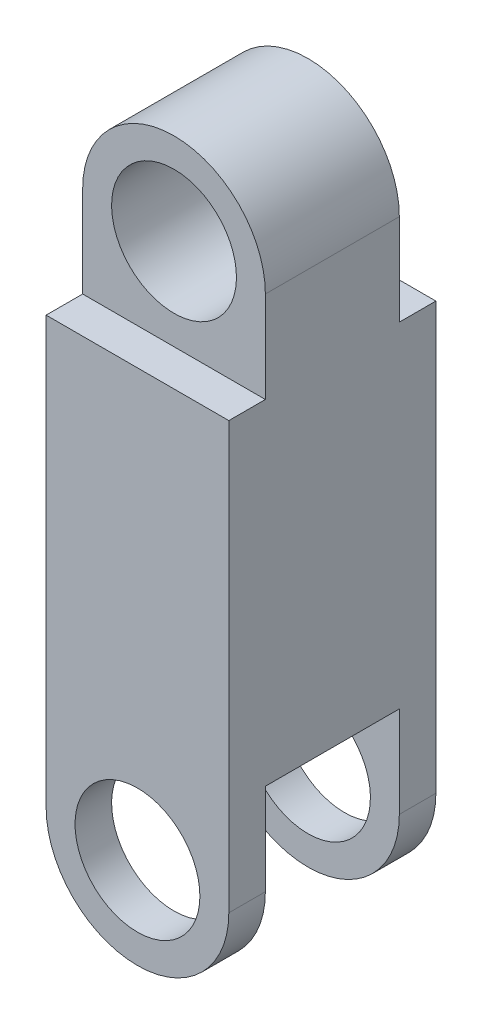
ISO-10303-21;
HEADER;
FILE_DESCRIPTION(('STEP AP214'),'2;1');
FILE_NAME('part.step','',(''),(''),'','','');
FILE_SCHEMA(('AUTOMOTIVE_DESIGN { 1 0 10303 214 1 1 1 1 }'));
ENDSEC;
DATA;
#1=APPLICATION_CONTEXT('core data for automotive mechanical design processes');
#2=APPLICATION_PROTOCOL_DEFINITION('international standard','automotive_design',2000,#1);
#3=PRODUCT_CONTEXT('',#1,'mechanical');
#4=PRODUCT('Part','Part','',(#3));
#5=PRODUCT_RELATED_PRODUCT_CATEGORY('part','',(#4));
#6=PRODUCT_DEFINITION_FORMATION('','',#4);
#7=PRODUCT_DEFINITION_CONTEXT('part definition',#1,'design');
#8=PRODUCT_DEFINITION('design','',#6,#7);
#9=PRODUCT_DEFINITION_SHAPE('','',#8);
#10=(LENGTH_UNIT() NAMED_UNIT(*) SI_UNIT(.MILLI.,.METRE.));
#11=(NAMED_UNIT(*) PLANE_ANGLE_UNIT() SI_UNIT($,.RADIAN.));
#12=(NAMED_UNIT(*) SI_UNIT($,.STERADIAN.) SOLID_ANGLE_UNIT());
#13=UNCERTAINTY_MEASURE_WITH_UNIT(LENGTH_MEASURE(1.E-05),#10,'distance_accuracy_value','');
#14=(GEOMETRIC_REPRESENTATION_CONTEXT(3) GLOBAL_UNCERTAINTY_ASSIGNED_CONTEXT((#13)) GLOBAL_UNIT_ASSIGNED_CONTEXT((#10,
#11,#12)) REPRESENTATION_CONTEXT('',''));
#15=CARTESIAN_POINT('',(0.,0.,0.));
#16=DIRECTION('',(0.,0.,1.));
#17=DIRECTION('',(1.,0.,0.));
#18=AXIS2_PLACEMENT_3D('',#15,#16,#17);
#19=CARTESIAN_POINT('',(0.,0.,34.));
#20=DIRECTION('',(0.,0.,1.));
#21=DIRECTION('',(1.,0.,0.));
#22=AXIS2_PLACEMENT_3D('',#19,#20,#21);
#23=PLANE('',#22);
#24=CARTESIAN_POINT('',(0.,-85.,34.));
#25=DIRECTION('',(0.,0.,1.));
#26=DIRECTION('',(1.,0.,0.));
#27=AXIS2_PLACEMENT_3D('',#24,#25,#26);
#28=CIRCLE('',#27,10.25);
#29=CARTESIAN_POINT('',(10.25,-85.,34.));
#30=VERTEX_POINT('',#29);
#31=EDGE_CURVE('E206',#30,#30,#28,.T.);
#32=ORIENTED_EDGE('',*,*,#31,.F.);
#33=EDGE_LOOP('',(#32));
#34=FACE_BOUND('',#33,.T.);
#35=DIRECTION('',(0.,-1.,0.));
#36=VECTOR('',#35,1.);
#37=CARTESIAN_POINT('',(15.,0.,34.));
#38=LINE('',#37,#36);
#39=CARTESIAN_POINT('',(15.,-15.,34.));
#40=VERTEX_POINT('',#39);
#41=CARTESIAN_POINT('',(15.,-85.,34.));
#42=VERTEX_POINT('',#41);
#43=EDGE_CURVE('E215',#40,#42,#38,.T.);
#44=ORIENTED_EDGE('',*,*,#43,.F.);
#45=DIRECTION('',(-1.,0.,0.));
#46=VECTOR('',#45,1.);
#47=CARTESIAN_POINT('',(15.,-15.,34.));
#48=LINE('',#47,#46);
#49=CARTESIAN_POINT('',(-15.,-15.,34.));
#50=VERTEX_POINT('',#49);
#51=EDGE_CURVE('E157',#40,#50,#48,.T.);
#52=ORIENTED_EDGE('',*,*,#51,.T.);
#53=DIRECTION('',(0.,-1.,0.));
#54=VECTOR('',#53,1.);
#55=CARTESIAN_POINT('',(-15.,0.,34.));
#56=LINE('',#55,#54);
#57=CARTESIAN_POINT('',(-15.,-85.,34.));
#58=VERTEX_POINT('',#57);
#59=EDGE_CURVE('E209',#50,#58,#56,.T.);
#60=ORIENTED_EDGE('',*,*,#59,.T.);
#61=CARTESIAN_POINT('',(0.,-85.,34.));
#62=DIRECTION('',(0.,0.,1.));
#63=DIRECTION('',(1.,0.,0.));
#64=AXIS2_PLACEMENT_3D('',#61,#62,#63);
#65=CIRCLE('',#64,15.);
#66=EDGE_CURVE('E212',#58,#42,#65,.T.);
#67=ORIENTED_EDGE('',*,*,#66,.T.);
#68=EDGE_LOOP('',(#44,#52,#60,#67));
#69=FACE_BOUND('',#68,.T.);
#70=ADVANCED_FACE('F45',(#34,#69),#23,.T.);
#71=CARTESIAN_POINT('',(0.,-85.,34.));
#72=DIRECTION('',(0.,0.,-1.));
#73=DIRECTION('',(-1.,0.,0.));
#74=AXIS2_PLACEMENT_3D('',#71,#72,#73);
#75=CYLINDRICAL_SURFACE('',#74,10.25);
#76=CARTESIAN_POINT('',(0.,-85.,28.));
#77=DIRECTION('',(0.,0.,1.));
#78=DIRECTION('',(0.,-1.,0.));
#79=AXIS2_PLACEMENT_3D('',#76,#77,#78);
#80=CIRCLE('',#79,10.25);
#81=CARTESIAN_POINT('',(0.,-95.25,28.));
#82=VERTEX_POINT('',#81);
#83=EDGE_CURVE('E49',#82,#82,#80,.T.);
#84=ORIENTED_EDGE('',*,*,#83,.F.);
#85=EDGE_LOOP('',(#84));
#86=FACE_BOUND('',#85,.T.);
#87=ORIENTED_EDGE('',*,*,#31,.T.);
#88=EDGE_LOOP('',(#87));
#89=FACE_BOUND('',#88,.T.);
#90=ADVANCED_FACE('F47',(#86,#89),#75,.F.);
#91=CARTESIAN_POINT('',(0.,0.,34.));
#92=DIRECTION('',(0.,0.,-1.));
#93=DIRECTION('',(-1.,0.,0.));
#94=AXIS2_PLACEMENT_3D('',#91,#92,#93);
#95=CYLINDRICAL_SURFACE('',#94,15.);
#96=CARTESIAN_POINT('',(0.,0.,28.));
#97=DIRECTION('',(0.,0.,-1.));
#98=DIRECTION('',(0.,1.,0.));
#99=AXIS2_PLACEMENT_3D('',#96,#97,#98);
#100=CIRCLE('',#99,15.);
#101=CARTESIAN_POINT('',(-15.,0.,28.));
#102=VERTEX_POINT('',#101);
#103=CARTESIAN_POINT('',(15.,0.,28.));
#104=VERTEX_POINT('',#103);
#105=EDGE_CURVE('E11',#102,#104,#100,.T.);
#106=ORIENTED_EDGE('',*,*,#105,.T.);
#107=DIRECTION('',(0.,0.,-1.));
#108=VECTOR('',#107,1.);
#109=CARTESIAN_POINT('',(15.,0.,34.));
#110=LINE('',#109,#108);
#111=CARTESIAN_POINT('',(15.,0.,6.00000000000002));
#112=VERTEX_POINT('',#111);
#113=EDGE_CURVE('E230',#104,#112,#110,.T.);
#114=ORIENTED_EDGE('',*,*,#113,.T.);
#115=CARTESIAN_POINT('',(0.,0.,6.00000000000002));
#116=DIRECTION('',(0.,0.,-1.));
#117=DIRECTION('',(0.,1.,0.));
#118=AXIS2_PLACEMENT_3D('',#115,#116,#117);
#119=CIRCLE('',#118,15.);
#120=CARTESIAN_POINT('',(-15.,0.,6.00000000000002));
#121=VERTEX_POINT('',#120);
#122=EDGE_CURVE('E54',#121,#112,#119,.T.);
#123=ORIENTED_EDGE('',*,*,#122,.F.);
#124=DIRECTION('',(0.,0.,-1.));
#125=VECTOR('',#124,1.);
#126=CARTESIAN_POINT('',(-15.,0.,34.));
#127=LINE('',#126,#125);
#128=EDGE_CURVE('E217',#102,#121,#127,.T.);
#129=ORIENTED_EDGE('',*,*,#128,.F.);
#130=EDGE_LOOP('',(#106,#114,#123,#129));
#131=FACE_BOUND('',#130,.T.);
#132=ADVANCED_FACE('F263',(#131),#95,.T.);
#133=CARTESIAN_POINT('',(0.,0.,0.));
#134=DIRECTION('',(0.,0.,1.));
#135=DIRECTION('',(1.,0.,0.));
#136=AXIS2_PLACEMENT_3D('',#133,#134,#135);
#137=PLANE('',#136);
#138=CARTESIAN_POINT('',(0.,-85.,0.));
#139=DIRECTION('',(0.,0.,1.));
#140=DIRECTION('',(1.,0.,0.));
#141=AXIS2_PLACEMENT_3D('',#138,#139,#140);
#142=CIRCLE('',#141,10.25);
#143=CARTESIAN_POINT('',(10.25,-85.,0.));
#144=VERTEX_POINT('',#143);
#145=EDGE_CURVE('E205',#144,#144,#142,.T.);
#146=ORIENTED_EDGE('',*,*,#145,.T.);
#147=EDGE_LOOP('',(#146));
#148=FACE_BOUND('',#147,.T.);
#149=DIRECTION('',(0.,-1.,0.));
#150=VECTOR('',#149,1.);
#151=CARTESIAN_POINT('',(-15.,0.,0.));
#152=LINE('',#151,#150);
#153=CARTESIAN_POINT('',(-15.,-15.,0.));
#154=VERTEX_POINT('',#153);
#155=CARTESIAN_POINT('',(-15.,-85.,0.));
#156=VERTEX_POINT('',#155);
#157=EDGE_CURVE('E220',#154,#156,#152,.T.);
#158=ORIENTED_EDGE('',*,*,#157,.F.);
#159=DIRECTION('',(-1.,0.,0.));
#160=VECTOR('',#159,1.);
#161=CARTESIAN_POINT('',(15.,-15.,0.));
#162=LINE('',#161,#160);
#163=CARTESIAN_POINT('',(15.,-15.,0.));
#164=VERTEX_POINT('',#163);
#165=EDGE_CURVE('E177',#164,#154,#162,.T.);
#166=ORIENTED_EDGE('',*,*,#165,.F.);
#167=DIRECTION('',(0.,-1.,0.));
#168=VECTOR('',#167,1.);
#169=CARTESIAN_POINT('',(15.,0.,0.));
#170=LINE('',#169,#168);
#171=CARTESIAN_POINT('',(15.,-85.,0.));
#172=VERTEX_POINT('',#171);
#173=EDGE_CURVE('E210',#164,#172,#170,.T.);
#174=ORIENTED_EDGE('',*,*,#173,.T.);
#175=CARTESIAN_POINT('',(0.,-85.,0.));
#176=DIRECTION('',(0.,0.,1.));
#177=DIRECTION('',(1.,0.,0.));
#178=AXIS2_PLACEMENT_3D('',#175,#176,#177);
#179=CIRCLE('',#178,15.);
#180=EDGE_CURVE('E223',#156,#172,#179,.T.);
#181=ORIENTED_EDGE('',*,*,#180,.F.);
#182=EDGE_LOOP('',(#158,#166,#174,#181));
#183=FACE_BOUND('',#182,.T.);
#184=ADVANCED_FACE('F271',(#148,#183),#137,.F.);
#185=ORIENTED_EDGE('',*,*,#145,.F.);
#186=EDGE_LOOP('',(#185));
#187=FACE_BOUND('',#186,.T.);
#188=CARTESIAN_POINT('',(0.,-85.,6.00000000000002));
#189=DIRECTION('',(0.,0.,1.));
#190=DIRECTION('',(0.,-1.,0.));
#191=AXIS2_PLACEMENT_3D('',#188,#189,#190);
#192=CIRCLE('',#191,10.25);
#193=CARTESIAN_POINT('',(0.,-95.25,6.00000000000002));
#194=VERTEX_POINT('',#193);
#195=EDGE_CURVE('E195',#194,#194,#192,.T.);
#196=ORIENTED_EDGE('',*,*,#195,.T.);
#197=EDGE_LOOP('',(#196));
#198=FACE_BOUND('',#197,.T.);
#199=ADVANCED_FACE('F243',(#187,#198),#75,.F.);
#200=CARTESIAN_POINT('',(15.,0.,34.));
#201=DIRECTION('',(1.,0.,0.));
#202=DIRECTION('',(0.,1.,0.));
#203=AXIS2_PLACEMENT_3D('',#200,#201,#202);
#204=PLANE('',#203);
#205=DIRECTION('',(0.,1.,0.));
#206=VECTOR('',#205,1.);
#207=CARTESIAN_POINT('',(15.,0.,28.));
#208=LINE('',#207,#206);
#209=CARTESIAN_POINT('',(15.,-85.,28.));
#210=VERTEX_POINT('',#209);
#211=CARTESIAN_POINT('',(15.,-70.,28.));
#212=VERTEX_POINT('',#211);
#213=EDGE_CURVE('E142',#210,#212,#208,.T.);
#214=ORIENTED_EDGE('',*,*,#213,.T.);
#215=DIRECTION('',(0.,0.,1.));
#216=VECTOR('',#215,1.);
#217=CARTESIAN_POINT('',(15.,-70.,0.));
#218=LINE('',#217,#216);
#219=CARTESIAN_POINT('',(15.,-70.,6.00000000000002));
#220=VERTEX_POINT('',#219);
#221=EDGE_CURVE('E143',#220,#212,#218,.T.);
#222=ORIENTED_EDGE('',*,*,#221,.F.);
#223=DIRECTION('',(0.,1.,0.));
#224=VECTOR('',#223,1.);
#225=CARTESIAN_POINT('',(15.,0.,6.00000000000002));
#226=LINE('',#225,#224);
#227=CARTESIAN_POINT('',(15.,-85.,6.00000000000002));
#228=VERTEX_POINT('',#227);
#229=EDGE_CURVE('E134',#228,#220,#226,.T.);
#230=ORIENTED_EDGE('',*,*,#229,.F.);
#231=DIRECTION('',(0.,0.,-1.));
#232=VECTOR('',#231,1.);
#233=CARTESIAN_POINT('',(15.,-85.,34.));
#234=LINE('',#233,#232);
#235=EDGE_CURVE('E233',#228,#172,#234,.T.);
#236=ORIENTED_EDGE('',*,*,#235,.T.);
#237=ORIENTED_EDGE('',*,*,#173,.F.);
#238=DIRECTION('',(0.,0.,1.));
#239=VECTOR('',#238,1.);
#240=CARTESIAN_POINT('',(15.,-15.,0.));
#241=LINE('',#240,#239);
#242=CARTESIAN_POINT('',(15.,-15.,6.00000000000002));
#243=VERTEX_POINT('',#242);
#244=EDGE_CURVE('E174',#164,#243,#241,.T.);
#245=ORIENTED_EDGE('',*,*,#244,.T.);
#246=DIRECTION('',(0.,-1.,0.));
#247=VECTOR('',#246,1.);
#248=CARTESIAN_POINT('',(15.,0.,6.00000000000002));
#249=LINE('',#248,#247);
#250=EDGE_CURVE('E172',#112,#243,#249,.T.);
#251=ORIENTED_EDGE('',*,*,#250,.F.);
#252=ORIENTED_EDGE('',*,*,#113,.F.);
#253=DIRECTION('',(0.,-1.,0.));
#254=VECTOR('',#253,1.);
#255=CARTESIAN_POINT('',(15.,0.,28.));
#256=LINE('',#255,#254);
#257=CARTESIAN_POINT('',(15.,-15.,28.));
#258=VERTEX_POINT('',#257);
#259=EDGE_CURVE('E165',#104,#258,#256,.T.);
#260=ORIENTED_EDGE('',*,*,#259,.T.);
#261=DIRECTION('',(0.,0.,-1.));
#262=VECTOR('',#261,1.);
#263=CARTESIAN_POINT('',(15.,-15.,0.));
#264=LINE('',#263,#262);
#265=EDGE_CURVE('E168',#40,#258,#264,.T.);
#266=ORIENTED_EDGE('',*,*,#265,.F.);
#267=ORIENTED_EDGE('',*,*,#43,.T.);
#268=EDGE_CURVE('E234',#42,#210,#234,.T.);
#269=ORIENTED_EDGE('',*,*,#268,.T.);
#270=EDGE_LOOP('',(#214,#222,#230,#236,#237,#245,#251,#252,#260,#266,#267,#269));
#271=FACE_BOUND('',#270,.T.);
#272=ADVANCED_FACE('F154',(#271),#204,.T.);
#273=CARTESIAN_POINT('',(0.,-85.,34.));
#274=DIRECTION('',(0.,0.,-1.));
#275=DIRECTION('',(-1.,0.,0.));
#276=AXIS2_PLACEMENT_3D('',#273,#274,#275);
#277=CYLINDRICAL_SURFACE('',#276,15.);
#278=ORIENTED_EDGE('',*,*,#235,.F.);
#279=CARTESIAN_POINT('',(0.,-85.,6.00000000000002));
#280=DIRECTION('',(0.,0.,1.));
#281=DIRECTION('',(0.,-1.,0.));
#282=AXIS2_PLACEMENT_3D('',#279,#280,#281);
#283=CIRCLE('',#282,15.);
#284=CARTESIAN_POINT('',(-15.,-85.,6.00000000000002));
#285=VERTEX_POINT('',#284);
#286=EDGE_CURVE('E62',#285,#228,#283,.T.);
#287=ORIENTED_EDGE('',*,*,#286,.F.);
#288=DIRECTION('',(0.,0.,-1.));
#289=VECTOR('',#288,1.);
#290=CARTESIAN_POINT('',(-15.,-85.,34.));
#291=LINE('',#290,#289);
#292=EDGE_CURVE('E236',#285,#156,#291,.T.);
#293=ORIENTED_EDGE('',*,*,#292,.T.);
#294=ORIENTED_EDGE('',*,*,#180,.T.);
#295=EDGE_LOOP('',(#278,#287,#293,#294));
#296=FACE_BOUND('',#295,.T.);
#297=ADVANCED_FACE('F280',(#296),#277,.T.);
#298=CARTESIAN_POINT('',(0.,-85.,28.));
#299=DIRECTION('',(0.,0.,1.));
#300=DIRECTION('',(0.,-1.,0.));
#301=AXIS2_PLACEMENT_3D('',#298,#299,#300);
#302=CIRCLE('',#301,15.);
#303=CARTESIAN_POINT('',(-15.,-85.,28.));
#304=VERTEX_POINT('',#303);
#305=EDGE_CURVE('E199',#304,#210,#302,.T.);
#306=ORIENTED_EDGE('',*,*,#305,.T.);
#307=ORIENTED_EDGE('',*,*,#268,.F.);
#308=ORIENTED_EDGE('',*,*,#66,.F.);
#309=EDGE_CURVE('E237',#58,#304,#291,.T.);
#310=ORIENTED_EDGE('',*,*,#309,.T.);
#311=EDGE_LOOP('',(#306,#307,#308,#310));
#312=FACE_BOUND('',#311,.T.);
#313=ADVANCED_FACE('F281',(#312),#277,.T.);
#314=CARTESIAN_POINT('',(-15.,0.,34.));
#315=DIRECTION('',(1.,0.,0.));
#316=DIRECTION('',(0.,1.,0.));
#317=AXIS2_PLACEMENT_3D('',#314,#315,#316);
#318=PLANE('',#317);
#319=DIRECTION('',(0.,0.,-1.));
#320=VECTOR('',#319,1.);
#321=CARTESIAN_POINT('',(-15.,-70.,34.));
#322=LINE('',#321,#320);
#323=CARTESIAN_POINT('',(-15.,-70.,28.));
#324=VERTEX_POINT('',#323);
#325=CARTESIAN_POINT('',(-15.,-70.,6.00000000000002));
#326=VERTEX_POINT('',#325);
#327=EDGE_CURVE('E150',#324,#326,#322,.T.);
#328=ORIENTED_EDGE('',*,*,#327,.F.);
#329=DIRECTION('',(0.,-1.,0.));
#330=VECTOR('',#329,1.);
#331=CARTESIAN_POINT('',(-15.,0.,28.));
#332=LINE('',#331,#330);
#333=EDGE_CURVE('E201',#324,#304,#332,.T.);
#334=ORIENTED_EDGE('',*,*,#333,.T.);
#335=ORIENTED_EDGE('',*,*,#309,.F.);
#336=ORIENTED_EDGE('',*,*,#59,.F.);
#337=DIRECTION('',(0.,0.,1.));
#338=VECTOR('',#337,1.);
#339=CARTESIAN_POINT('',(-15.,-15.,34.));
#340=LINE('',#339,#338);
#341=CARTESIAN_POINT('',(-15.,-15.,28.));
#342=VERTEX_POINT('',#341);
#343=EDGE_CURVE('E70',#342,#50,#340,.T.);
#344=ORIENTED_EDGE('',*,*,#343,.F.);
#345=DIRECTION('',(0.,1.,0.));
#346=VECTOR('',#345,1.);
#347=CARTESIAN_POINT('',(-15.,0.,28.));
#348=LINE('',#347,#346);
#349=EDGE_CURVE('E189',#342,#102,#348,.T.);
#350=ORIENTED_EDGE('',*,*,#349,.T.);
#351=ORIENTED_EDGE('',*,*,#128,.T.);
#352=DIRECTION('',(0.,1.,0.));
#353=VECTOR('',#352,1.);
#354=CARTESIAN_POINT('',(-15.,0.,6.00000000000002));
#355=LINE('',#354,#353);
#356=CARTESIAN_POINT('',(-15.,-15.,6.00000000000002));
#357=VERTEX_POINT('',#356);
#358=EDGE_CURVE('E184',#357,#121,#355,.T.);
#359=ORIENTED_EDGE('',*,*,#358,.F.);
#360=DIRECTION('',(0.,0.,-1.));
#361=VECTOR('',#360,1.);
#362=CARTESIAN_POINT('',(-15.,-15.,34.));
#363=LINE('',#362,#361);
#364=EDGE_CURVE('E163',#357,#154,#363,.T.);
#365=ORIENTED_EDGE('',*,*,#364,.T.);
#366=ORIENTED_EDGE('',*,*,#157,.T.);
#367=ORIENTED_EDGE('',*,*,#292,.F.);
#368=DIRECTION('',(0.,-1.,0.));
#369=VECTOR('',#368,1.);
#370=CARTESIAN_POINT('',(-15.,0.,6.00000000000003));
#371=LINE('',#370,#369);
#372=EDGE_CURVE('E197',#326,#285,#371,.T.);
#373=ORIENTED_EDGE('',*,*,#372,.F.);
#374=EDGE_LOOP('',(#328,#334,#335,#336,#344,#350,#351,#359,#365,#366,#367,#373));
#375=FACE_BOUND('',#374,.T.);
#376=ADVANCED_FACE('F284',(#375),#318,.F.);
#377=CARTESIAN_POINT('',(15.,0.,6.00000000000002));
#378=DIRECTION('',(0.,0.,-1.));
#379=DIRECTION('',(0.,1.,0.));
#380=AXIS2_PLACEMENT_3D('',#377,#378,#379);
#381=PLANE('',#380);
#382=CARTESIAN_POINT('',(0.,0.,6.00000000000002));
#383=DIRECTION('',(0.,0.,-1.));
#384=DIRECTION('',(0.,1.,0.));
#385=AXIS2_PLACEMENT_3D('',#382,#383,#384);
#386=CIRCLE('',#385,10.25);
#387=CARTESIAN_POINT('',(0.,10.25,6.00000000000002));
#388=VERTEX_POINT('',#387);
#389=EDGE_CURVE('E186',#388,#388,#386,.T.);
#390=ORIENTED_EDGE('',*,*,#389,.F.);
#391=EDGE_LOOP('',(#390));
#392=FACE_BOUND('',#391,.T.);
#393=ORIENTED_EDGE('',*,*,#358,.T.);
#394=ORIENTED_EDGE('',*,*,#122,.T.);
#395=ORIENTED_EDGE('',*,*,#250,.T.);
#396=DIRECTION('',(-1.,0.,0.));
#397=VECTOR('',#396,1.);
#398=CARTESIAN_POINT('',(15.,-15.,6.00000000000002));
#399=LINE('',#398,#397);
#400=EDGE_CURVE('E169',#243,#357,#399,.T.);
#401=ORIENTED_EDGE('',*,*,#400,.T.);
#402=EDGE_LOOP('',(#393,#394,#395,#401));
#403=FACE_BOUND('',#402,.T.);
#404=ADVANCED_FACE('F269',(#392,#403),#381,.T.);
#405=CARTESIAN_POINT('',(15.,-15.,0.));
#406=DIRECTION('',(0.,-1.,0.));
#407=DIRECTION('',(1.,0.,0.));
#408=AXIS2_PLACEMENT_3D('',#405,#406,#407);
#409=PLANE('',#408);
#410=ORIENTED_EDGE('',*,*,#400,.F.);
#411=ORIENTED_EDGE('',*,*,#244,.F.);
#412=ORIENTED_EDGE('',*,*,#165,.T.);
#413=ORIENTED_EDGE('',*,*,#364,.F.);
#414=EDGE_LOOP('',(#410,#411,#412,#413));
#415=FACE_BOUND('',#414,.T.);
#416=ADVANCED_FACE('F291',(#415),#409,.F.);
#417=CARTESIAN_POINT('',(15.,0.,28.));
#418=DIRECTION('',(0.,0.,-1.));
#419=DIRECTION('',(0.,1.,0.));
#420=AXIS2_PLACEMENT_3D('',#417,#418,#419);
#421=PLANE('',#420);
#422=CARTESIAN_POINT('',(0.,0.,28.));
#423=DIRECTION('',(0.,0.,-1.));
#424=DIRECTION('',(0.,1.,0.));
#425=AXIS2_PLACEMENT_3D('',#422,#423,#424);
#426=CIRCLE('',#425,10.25);
#427=CARTESIAN_POINT('',(0.,10.25,28.));
#428=VERTEX_POINT('',#427);
#429=EDGE_CURVE('E192',#428,#428,#426,.T.);
#430=ORIENTED_EDGE('',*,*,#429,.T.);
#431=EDGE_LOOP('',(#430));
#432=FACE_BOUND('',#431,.T.);
#433=DIRECTION('',(-1.,0.,0.));
#434=VECTOR('',#433,1.);
#435=CARTESIAN_POINT('',(15.,-15.,28.));
#436=LINE('',#435,#434);
#437=EDGE_CURVE('E159',#258,#342,#436,.T.);
#438=ORIENTED_EDGE('',*,*,#437,.F.);
#439=ORIENTED_EDGE('',*,*,#259,.F.);
#440=ORIENTED_EDGE('',*,*,#105,.F.);
#441=ORIENTED_EDGE('',*,*,#349,.F.);
#442=EDGE_LOOP('',(#438,#439,#440,#441));
#443=FACE_BOUND('',#442,.T.);
#444=ADVANCED_FACE('F314',(#432,#443),#421,.F.);
#445=CARTESIAN_POINT('',(15.,-15.,0.));
#446=DIRECTION('',(0.,1.,0.));
#447=DIRECTION('',(-1.,0.,0.));
#448=AXIS2_PLACEMENT_3D('',#445,#446,#447);
#449=PLANE('',#448);
#450=ORIENTED_EDGE('',*,*,#343,.T.);
#451=ORIENTED_EDGE('',*,*,#51,.F.);
#452=ORIENTED_EDGE('',*,*,#265,.T.);
#453=ORIENTED_EDGE('',*,*,#437,.T.);
#454=EDGE_LOOP('',(#450,#451,#452,#453));
#455=FACE_BOUND('',#454,.T.);
#456=ADVANCED_FACE('F315',(#455),#449,.T.);
#457=CARTESIAN_POINT('',(15.,-70.,0.));
#458=DIRECTION('',(0.,-1.,0.));
#459=DIRECTION('',(1.,0.,0.));
#460=AXIS2_PLACEMENT_3D('',#457,#458,#459);
#461=PLANE('',#460);
#462=ORIENTED_EDGE('',*,*,#327,.T.);
#463=DIRECTION('',(-1.,0.,0.));
#464=VECTOR('',#463,1.);
#465=CARTESIAN_POINT('',(15.,-70.,6.00000000000002));
#466=LINE('',#465,#464);
#467=EDGE_CURVE('E137',#220,#326,#466,.T.);
#468=ORIENTED_EDGE('',*,*,#467,.F.);
#469=ORIENTED_EDGE('',*,*,#221,.T.);
#470=DIRECTION('',(-1.,0.,0.));
#471=VECTOR('',#470,1.);
#472=CARTESIAN_POINT('',(15.,-70.,28.));
#473=LINE('',#472,#471);
#474=EDGE_CURVE('E151',#212,#324,#473,.T.);
#475=ORIENTED_EDGE('',*,*,#474,.T.);
#476=EDGE_LOOP('',(#462,#468,#469,#475));
#477=FACE_BOUND('',#476,.T.);
#478=ADVANCED_FACE('F146',(#477),#461,.T.);
#479=CARTESIAN_POINT('',(15.,0.,28.));
#480=DIRECTION('',(0.,0.,1.));
#481=DIRECTION('',(0.,-1.,0.));
#482=AXIS2_PLACEMENT_3D('',#479,#480,#481);
#483=PLANE('',#482);
#484=ORIENTED_EDGE('',*,*,#83,.T.);
#485=EDGE_LOOP('',(#484));
#486=FACE_BOUND('',#485,.T.);
#487=ORIENTED_EDGE('',*,*,#474,.F.);
#488=ORIENTED_EDGE('',*,*,#213,.F.);
#489=ORIENTED_EDGE('',*,*,#305,.F.);
#490=ORIENTED_EDGE('',*,*,#333,.F.);
#491=EDGE_LOOP('',(#487,#488,#489,#490));
#492=FACE_BOUND('',#491,.T.);
#493=ADVANCED_FACE('F247',(#486,#492),#483,.F.);
#494=CARTESIAN_POINT('',(15.,0.,6.00000000000002));
#495=DIRECTION('',(0.,0.,1.));
#496=DIRECTION('',(0.,-1.,0.));
#497=AXIS2_PLACEMENT_3D('',#494,#495,#496);
#498=PLANE('',#497);
#499=ORIENTED_EDGE('',*,*,#195,.F.);
#500=EDGE_LOOP('',(#499));
#501=FACE_BOUND('',#500,.T.);
#502=ORIENTED_EDGE('',*,*,#372,.T.);
#503=ORIENTED_EDGE('',*,*,#286,.T.);
#504=ORIENTED_EDGE('',*,*,#229,.T.);
#505=ORIENTED_EDGE('',*,*,#467,.T.);
#506=EDGE_LOOP('',(#502,#503,#504,#505));
#507=FACE_BOUND('',#506,.T.);
#508=ADVANCED_FACE('F136',(#501,#507),#498,.T.);
#509=CARTESIAN_POINT('',(0.,0.,34.));
#510=DIRECTION('',(0.,0.,-1.));
#511=DIRECTION('',(-1.,0.,0.));
#512=AXIS2_PLACEMENT_3D('',#509,#510,#511);
#513=CYLINDRICAL_SURFACE('',#512,10.25);
#514=ORIENTED_EDGE('',*,*,#429,.F.);
#515=EDGE_LOOP('',(#514));
#516=FACE_BOUND('',#515,.T.);
#517=ORIENTED_EDGE('',*,*,#389,.T.);
#518=EDGE_LOOP('',(#517));
#519=FACE_BOUND('',#518,.T.);
#520=ADVANCED_FACE('F246',(#516,#519),#513,.F.);
#521=CLOSED_SHELL('',(#70,#90,#132,#184,#199,#272,#297,#313,#376,#404,#416,#444,#456,#478,#493,
#508,#520));
#522=MANIFOLD_SOLID_BREP('B2',#521);
#523=ADVANCED_BREP_SHAPE_REPRESENTATION('',(#18,#522),#14);
#524=SHAPE_DEFINITION_REPRESENTATION(#9,#523);
ENDSEC;
END-ISO-10303-21;
